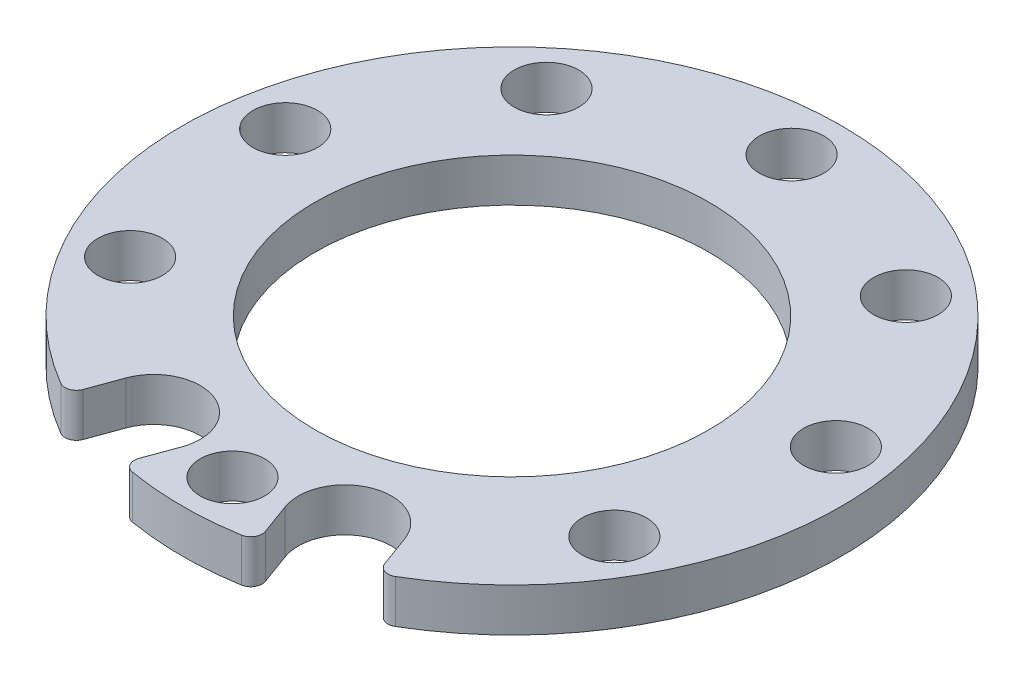
ISO-10303-21;
HEADER;
FILE_DESCRIPTION(('STEP AP214'),'2;1');
FILE_NAME('part.step','',(''),(''),'','','');
FILE_SCHEMA(('AUTOMOTIVE_DESIGN { 1 0 10303 214 1 1 1 1 }'));
ENDSEC;
DATA;
#1=APPLICATION_CONTEXT('core data for automotive mechanical design processes');
#2=APPLICATION_PROTOCOL_DEFINITION('international standard','automotive_design',2000,#1);
#3=PRODUCT_CONTEXT('',#1,'mechanical');
#4=PRODUCT('Part','Part','',(#3));
#5=PRODUCT_RELATED_PRODUCT_CATEGORY('part','',(#4));
#6=PRODUCT_DEFINITION_FORMATION('','',#4);
#7=PRODUCT_DEFINITION_CONTEXT('part definition',#1,'design');
#8=PRODUCT_DEFINITION('design','',#6,#7);
#9=PRODUCT_DEFINITION_SHAPE('','',#8);
#10=(LENGTH_UNIT() NAMED_UNIT(*) SI_UNIT(.MILLI.,.METRE.));
#11=(NAMED_UNIT(*) PLANE_ANGLE_UNIT() SI_UNIT($,.RADIAN.));
#12=(NAMED_UNIT(*) SI_UNIT($,.STERADIAN.) SOLID_ANGLE_UNIT());
#13=UNCERTAINTY_MEASURE_WITH_UNIT(LENGTH_MEASURE(1.E-05),#10,'distance_accuracy_value','');
#14=(GEOMETRIC_REPRESENTATION_CONTEXT(3) GLOBAL_UNCERTAINTY_ASSIGNED_CONTEXT((#13)) GLOBAL_UNIT_ASSIGNED_CONTEXT((#10,
#11,#12)) REPRESENTATION_CONTEXT('',''));
#15=CARTESIAN_POINT('',(0.,0.,0.));
#16=DIRECTION('',(0.,0.,1.));
#17=DIRECTION('',(1.,0.,0.));
#18=AXIS2_PLACEMENT_3D('',#15,#16,#17);
#19=CARTESIAN_POINT('',(0.,6.04774,0.));
#20=DIRECTION('',(0.,-1.,0.));
#21=DIRECTION('',(0.,0.,-1.));
#22=AXIS2_PLACEMENT_3D('',#19,#20,#21);
#23=CYLINDRICAL_SURFACE('',#22,45.974);
#24=CARTESIAN_POINT('',(0.,6.04774,0.));
#25=DIRECTION('',(0.,1.,0.));
#26=DIRECTION('',(0.,0.,1.));
#27=AXIS2_PLACEMENT_3D('',#24,#25,#26);
#28=CIRCLE('',#27,45.974);
#29=CARTESIAN_POINT('',(23.3323913389135,6.04774,39.6132325165189));
#30=VERTEX_POINT('',#29);
#31=CARTESIAN_POINT('',(-23.3323913389135,6.04774,39.6132325165189));
#32=VERTEX_POINT('',#31);
#33=EDGE_CURVE('E187',#30,#32,#28,.T.);
#34=ORIENTED_EDGE('',*,*,#33,.F.);
#35=DIRECTION('',(0.,-1.,0.));
#36=VECTOR('',#35,1.);
#37=CARTESIAN_POINT('',(23.3323913389135,6.04774,39.6132325165189));
#38=LINE('',#37,#36);
#39=CARTESIAN_POINT('',(23.3323913389135,0.,39.6132325165189));
#40=VERTEX_POINT('',#39);
#41=EDGE_CURVE('E11',#30,#40,#38,.T.);
#42=ORIENTED_EDGE('',*,*,#41,.T.);
#43=CARTESIAN_POINT('',(0.,0.,0.));
#44=DIRECTION('',(0.,1.,0.));
#45=DIRECTION('',(0.,0.,1.));
#46=AXIS2_PLACEMENT_3D('',#43,#44,#45);
#47=CIRCLE('',#46,45.974);
#48=CARTESIAN_POINT('',(-23.3323913389135,0.,39.6132325165189));
#49=VERTEX_POINT('',#48);
#50=EDGE_CURVE('E178',#40,#49,#47,.T.);
#51=ORIENTED_EDGE('',*,*,#50,.T.);
#52=DIRECTION('',(0.,-1.,0.));
#53=VECTOR('',#52,1.);
#54=CARTESIAN_POINT('',(-23.3323913389135,6.04774,39.6132325165189));
#55=LINE('',#54,#53);
#56=EDGE_CURVE('E201',#49,#32,#55,.F.);
#57=ORIENTED_EDGE('',*,*,#56,.T.);
#58=EDGE_LOOP('',(#34,#42,#51,#57));
#59=FACE_BOUND('',#58,.T.);
#60=ADVANCED_FACE('F41',(#59),#23,.T.);
#61=CARTESIAN_POINT('',(13.3387855897043,6.04774,36.6480122106499));
#62=DIRECTION('',(0.,-1.,0.));
#63=DIRECTION('',(0.,0.,-1.));
#64=AXIS2_PLACEMENT_3D('',#61,#62,#63);
#65=CYLINDRICAL_SURFACE('',#64,6.5);
#66=CARTESIAN_POINT('',(13.3387855897043,6.04774,36.6480122106499));
#67=DIRECTION('',(0.,1.,0.));
#68=DIRECTION('',(0.,0.,1.));
#69=AXIS2_PLACEMENT_3D('',#66,#67,#68);
#70=CIRCLE('',#69,6.5);
#71=CARTESIAN_POINT('',(19.4467876248127,6.04774,34.424881279033));
#72=VERTEX_POINT('',#71);
#73=CARTESIAN_POINT('',(7.23078355458947,6.04774,38.8711431422678));
#74=VERTEX_POINT('',#73);
#75=EDGE_CURVE('E155',#72,#74,#70,.T.);
#76=ORIENTED_EDGE('',*,*,#75,.T.);
#77=DIRECTION('',(0.,1.,0.));
#78=VECTOR('',#77,1.);
#79=CARTESIAN_POINT('',(7.23078355458947,0.,38.8711431422678));
#80=LINE('',#79,#78);
#81=CARTESIAN_POINT('',(7.2307835545959,0.,38.8711431422667));
#82=VERTEX_POINT('',#81);
#83=EDGE_CURVE('E142',#82,#74,#80,.T.);
#84=ORIENTED_EDGE('',*,*,#83,.F.);
#85=CARTESIAN_POINT('',(13.3387855897043,0.,36.6480122106499));
#86=DIRECTION('',(0.,1.,0.));
#87=DIRECTION('',(0.,0.,1.));
#88=AXIS2_PLACEMENT_3D('',#85,#86,#87);
#89=CIRCLE('',#88,6.5);
#90=CARTESIAN_POINT('',(19.4467876248063,0.,34.4248812790341));
#91=VERTEX_POINT('',#90);
#92=EDGE_CURVE('E148',#91,#82,#89,.T.);
#93=ORIENTED_EDGE('',*,*,#92,.F.);
#94=DIRECTION('',(0.,1.,0.));
#95=VECTOR('',#94,1.);
#96=CARTESIAN_POINT('',(19.4467876248063,0.,34.4248812790341));
#97=LINE('',#96,#95);
#98=EDGE_CURVE('E130',#91,#72,#97,.T.);
#99=ORIENTED_EDGE('',*,*,#98,.T.);
#100=EDGE_LOOP('',(#76,#84,#93,#99));
#101=FACE_BOUND('',#100,.T.);
#102=ADVANCED_FACE('F153',(#101),#65,.F.);
#103=CARTESIAN_POINT('',(0.,6.04774,0.));
#104=DIRECTION('',(0.,1.,0.));
#105=DIRECTION('',(0.,0.,1.));
#106=AXIS2_PLACEMENT_3D('',#103,#104,#105);
#107=PLANE('',#106);
#108=CARTESIAN_POINT('',(-7.58924631139159,6.04774,45.3432687002716));
#109=VERTEX_POINT('',#108);
#110=CARTESIAN_POINT('',(7.58924631139159,6.04774,45.3432687002716));
#111=VERTEX_POINT('',#110);
#112=EDGE_CURVE('E182',#109,#111,#28,.T.);
#113=ORIENTED_EDGE('',*,*,#112,.T.);
#114=CARTESIAN_POINT('',(7.3271867011916,6.04774,43.7775480959804));
#115=DIRECTION('',(0.,1.,0.));
#116=DIRECTION('',(0.,0.,1.));
#117=AXIS2_PLACEMENT_3D('',#114,#115,#116);
#118=CIRCLE('',#117,1.5875);
#119=CARTESIAN_POINT('',(8.81894873668922,6.04774,43.2345911184509));
#120=VERTEX_POINT('',#119);
#121=EDGE_CURVE('E225',#111,#120,#118,.T.);
#122=ORIENTED_EDGE('',*,*,#121,.T.);
#123=DIRECTION('',(0.34202014332567,0.,0.939692620785908));
#124=VECTOR('',#123,1.);
#125=CARTESIAN_POINT('',(-6.10800203511149,6.04774,2.22313093161798));
#126=LINE('',#125,#124);
#127=EDGE_CURVE('E242',#74,#120,#126,.T.);
#128=ORIENTED_EDGE('',*,*,#127,.F.);
#129=ORIENTED_EDGE('',*,*,#75,.F.);
#130=DIRECTION('',(0.342020143325668,0.,0.939692620785909));
#131=VECTOR('',#130,1.);
#132=CARTESIAN_POINT('',(6.1080020351054,6.04774,-2.22313093161575));
#133=LINE('',#132,#131);
#134=CARTESIAN_POINT('',(21.0349528069064,6.04774,38.7883292552184));
#135=VERTEX_POINT('',#134);
#136=EDGE_CURVE('E136',#72,#135,#133,.T.);
#137=ORIENTED_EDGE('',*,*,#136,.T.);
#138=CARTESIAN_POINT('',(22.5267148424041,6.04774,38.2453722776889));
#139=DIRECTION('',(0.,1.,0.));
#140=DIRECTION('',(0.,0.,1.));
#141=AXIS2_PLACEMENT_3D('',#138,#139,#140);
#142=CIRCLE('',#141,1.5875);
#143=EDGE_CURVE('E222',#135,#30,#142,.T.);
#144=ORIENTED_EDGE('',*,*,#143,.T.);
#145=ORIENTED_EDGE('',*,*,#33,.T.);
#146=CARTESIAN_POINT('',(-22.5267148424041,6.04774,38.2453722776889));
#147=DIRECTION('',(0.,1.,0.));
#148=DIRECTION('',(0.,0.,1.));
#149=AXIS2_PLACEMENT_3D('',#146,#147,#148);
#150=CIRCLE('',#149,1.5875);
#151=CARTESIAN_POINT('',(-21.0349528069064,6.04774,38.7883292552184));
#152=VERTEX_POINT('',#151);
#153=EDGE_CURVE('E195',#32,#152,#150,.T.);
#154=ORIENTED_EDGE('',*,*,#153,.T.);
#155=DIRECTION('',(-0.342020143325668,0.,0.939692620785909));
#156=VECTOR('',#155,1.);
#157=CARTESIAN_POINT('',(-6.1080020351054,6.04774,-2.22313093161575));
#158=LINE('',#157,#156);
#159=CARTESIAN_POINT('',(-19.4467876248063,6.04774,34.4248812790341));
#160=VERTEX_POINT('',#159);
#161=EDGE_CURVE('E258',#160,#152,#158,.T.);
#162=ORIENTED_EDGE('',*,*,#161,.F.);
#163=CARTESIAN_POINT('',(-13.3387855896979,6.04774,36.648012210651));
#164=DIRECTION('',(0.,1.,0.));
#165=DIRECTION('',(0.,0.,1.));
#166=AXIS2_PLACEMENT_3D('',#163,#164,#165);
#167=CIRCLE('',#166,6.5);
#168=CARTESIAN_POINT('',(-7.23078355458947,6.04774,38.8711431422678));
#169=VERTEX_POINT('',#168);
#170=EDGE_CURVE('E166',#169,#160,#167,.T.);
#171=ORIENTED_EDGE('',*,*,#170,.F.);
#172=DIRECTION('',(-0.34202014332567,0.,0.939692620785908));
#173=VECTOR('',#172,1.);
#174=CARTESIAN_POINT('',(6.10800203511149,6.04774,2.22313093161798));
#175=LINE('',#174,#173);
#176=CARTESIAN_POINT('',(-8.81894873668922,6.04774,43.2345911184509));
#177=VERTEX_POINT('',#176);
#178=EDGE_CURVE('E251',#169,#177,#175,.T.);
#179=ORIENTED_EDGE('',*,*,#178,.T.);
#180=CARTESIAN_POINT('',(-7.3271867011916,6.04774,43.7775480959804));
#181=DIRECTION('',(0.,1.,0.));
#182=DIRECTION('',(0.,0.,1.));
#183=AXIS2_PLACEMENT_3D('',#180,#181,#182);
#184=CIRCLE('',#183,1.5875);
#185=EDGE_CURVE('E198',#177,#109,#184,.T.);
#186=ORIENTED_EDGE('',*,*,#185,.T.);
#187=EDGE_LOOP('',(#113,#122,#128,#129,#137,#144,#145,#154,#162,#171,#179,#186));
#188=FACE_BOUND('',#187,.T.);
#189=CARTESIAN_POINT('',(-25.0687167777747,6.04774,-29.8757332816405));
#190=DIRECTION('',(0.,1.,0.));
#191=DIRECTION('',(0.,0.,1.));
#192=AXIS2_PLACEMENT_3D('',#189,#190,#191);
#193=CIRCLE('',#192,4.49999999999999);
#194=CARTESIAN_POINT('',(-25.0687167777747,6.04774,-25.3757332816405));
#195=VERTEX_POINT('',#194);
#196=EDGE_CURVE('E272',#195,#195,#193,.T.);
#197=ORIENTED_EDGE('',*,*,#196,.F.);
#198=EDGE_LOOP('',(#197));
#199=FACE_BOUND('',#198,.T.);
#200=CARTESIAN_POINT('',(-38.407502367476,6.04774,-6.77227892901068));
#201=DIRECTION('',(0.,1.,0.));
#202=DIRECTION('',(0.,0.,1.));
#203=AXIS2_PLACEMENT_3D('',#200,#201,#202);
#204=CIRCLE('',#203,4.49999999999999);
#205=CARTESIAN_POINT('',(-38.407502367476,6.04774,-2.27227892901069));
#206=VERTEX_POINT('',#205);
#207=EDGE_CURVE('E283',#206,#206,#204,.T.);
#208=ORIENTED_EDGE('',*,*,#207,.F.);
#209=EDGE_LOOP('',(#208));
#210=FACE_BOUND('',#209,.T.);
#211=CARTESIAN_POINT('',(-33.7749907475933,6.04774,19.4999999999997));
#212=DIRECTION('',(0.,1.,0.));
#213=DIRECTION('',(0.,0.,1.));
#214=AXIS2_PLACEMENT_3D('',#211,#212,#213);
#215=CIRCLE('',#214,4.49999999999999);
#216=CARTESIAN_POINT('',(-33.7749907475933,6.04774,23.9999999999997));
#217=VERTEX_POINT('',#216);
#218=EDGE_CURVE('E291',#217,#217,#215,.T.);
#219=ORIENTED_EDGE('',*,*,#218,.F.);
#220=EDGE_LOOP('',(#219));
#221=FACE_BOUND('',#220,.T.);
#222=CARTESIAN_POINT('',(0.,6.04774,39.));
#223=DIRECTION('',(0.,1.,0.));
#224=DIRECTION('',(0.,0.,1.));
#225=AXIS2_PLACEMENT_3D('',#222,#223,#224);
#226=CIRCLE('',#225,4.49999999999999);
#227=CARTESIAN_POINT('',(0.,6.04774,43.5));
#228=VERTEX_POINT('',#227);
#229=EDGE_CURVE('E299',#228,#228,#226,.T.);
#230=ORIENTED_EDGE('',*,*,#229,.F.);
#231=EDGE_LOOP('',(#230));
#232=FACE_BOUND('',#231,.T.);
#233=CARTESIAN_POINT('',(33.774990747593,6.04774,19.5000000000002));
#234=DIRECTION('',(0.,1.,0.));
#235=DIRECTION('',(0.,0.,1.));
#236=AXIS2_PLACEMENT_3D('',#233,#234,#235);
#237=CIRCLE('',#236,4.49999999999999);
#238=CARTESIAN_POINT('',(33.774990747593,6.04774,24.0000000000001));
#239=VERTEX_POINT('',#238);
#240=EDGE_CURVE('E307',#239,#239,#237,.T.);
#241=ORIENTED_EDGE('',*,*,#240,.F.);
#242=EDGE_LOOP('',(#241));
#243=FACE_BOUND('',#242,.T.);
#244=CARTESIAN_POINT('',(38.4075023674761,6.04774,-6.77227892901017));
#245=DIRECTION('',(0.,1.,0.));
#246=DIRECTION('',(0.,0.,1.));
#247=AXIS2_PLACEMENT_3D('',#244,#245,#246);
#248=CIRCLE('',#247,4.49999999999999);
#249=CARTESIAN_POINT('',(38.4075023674761,6.04774,-2.27227892901018));
#250=VERTEX_POINT('',#249);
#251=EDGE_CURVE('E315',#250,#250,#248,.T.);
#252=ORIENTED_EDGE('',*,*,#251,.F.);
#253=EDGE_LOOP('',(#252));
#254=FACE_BOUND('',#253,.T.);
#255=CARTESIAN_POINT('',(25.0687167777751,6.04774,-29.8757332816401));
#256=DIRECTION('',(0.,1.,0.));
#257=DIRECTION('',(0.,0.,1.));
#258=AXIS2_PLACEMENT_3D('',#255,#256,#257);
#259=CIRCLE('',#258,4.49999999999999);
#260=CARTESIAN_POINT('',(25.0687167777751,6.04774,-25.3757332816401));
#261=VERTEX_POINT('',#260);
#262=EDGE_CURVE('E323',#261,#261,#259,.T.);
#263=ORIENTED_EDGE('',*,*,#262,.F.);
#264=EDGE_LOOP('',(#263));
#265=FACE_BOUND('',#264,.T.);
#266=CARTESIAN_POINT('',(0.,6.04774,-39.));
#267=DIRECTION('',(0.,1.,0.));
#268=DIRECTION('',(0.,0.,1.));
#269=AXIS2_PLACEMENT_3D('',#266,#267,#268);
#270=CIRCLE('',#269,4.49999999999999);
#271=CARTESIAN_POINT('',(0.,6.04774,-34.5));
#272=VERTEX_POINT('',#271);
#273=EDGE_CURVE('E163',#272,#272,#270,.T.);
#274=ORIENTED_EDGE('',*,*,#273,.F.);
#275=EDGE_LOOP('',(#274));
#276=FACE_BOUND('',#275,.T.);
#277=CARTESIAN_POINT('',(0.,6.04774,0.));
#278=DIRECTION('',(0.,1.,0.));
#279=DIRECTION('',(0.,0.,1.));
#280=AXIS2_PLACEMENT_3D('',#277,#278,#279);
#281=CIRCLE('',#280,27.4955);
#282=CARTESIAN_POINT('',(0.,6.04774,27.4955));
#283=VERTEX_POINT('',#282);
#284=EDGE_CURVE('E174',#283,#283,#281,.T.);
#285=ORIENTED_EDGE('',*,*,#284,.F.);
#286=EDGE_LOOP('',(#285));
#287=FACE_BOUND('',#286,.T.);
#288=ADVANCED_FACE('F238',(#188,#199,#210,#221,#232,#243,#254,#265,#276,#287),#107,.T.);
#289=CARTESIAN_POINT('',(0.,0.,0.));
#290=DIRECTION('',(0.,1.,0.));
#291=DIRECTION('',(0.,0.,1.));
#292=AXIS2_PLACEMENT_3D('',#289,#290,#291);
#293=PLANE('',#292);
#294=DIRECTION('',(0.34202014332567,0.,0.939692620785908));
#295=VECTOR('',#294,1.);
#296=CARTESIAN_POINT('',(-6.10800203511149,0.,2.22313093161798));
#297=LINE('',#296,#295);
#298=CARTESIAN_POINT('',(8.81894873668922,0.,43.2345911184509));
#299=VERTEX_POINT('',#298);
#300=EDGE_CURVE('E150',#82,#299,#297,.T.);
#301=ORIENTED_EDGE('',*,*,#300,.T.);
#302=CARTESIAN_POINT('',(7.3271867011916,0.,43.7775480959804));
#303=DIRECTION('',(0.,1.,0.));
#304=DIRECTION('',(0.,0.,1.));
#305=AXIS2_PLACEMENT_3D('',#302,#303,#304);
#306=CIRCLE('',#305,1.5875);
#307=CARTESIAN_POINT('',(7.58924631139159,0.,45.3432687002716));
#308=VERTEX_POINT('',#307);
#309=EDGE_CURVE('E233',#299,#308,#306,.F.);
#310=ORIENTED_EDGE('',*,*,#309,.T.);
#311=CARTESIAN_POINT('',(-7.58924631139159,0.,45.3432687002716));
#312=VERTEX_POINT('',#311);
#313=EDGE_CURVE('E188',#312,#308,#47,.T.);
#314=ORIENTED_EDGE('',*,*,#313,.F.);
#315=CARTESIAN_POINT('',(-7.3271867011916,0.,43.7775480959804));
#316=DIRECTION('',(0.,1.,0.));
#317=DIRECTION('',(0.,0.,1.));
#318=AXIS2_PLACEMENT_3D('',#315,#316,#317);
#319=CIRCLE('',#318,1.5875);
#320=CARTESIAN_POINT('',(-8.81894873668922,0.,43.2345911184509));
#321=VERTEX_POINT('',#320);
#322=EDGE_CURVE('E212',#312,#321,#319,.F.);
#323=ORIENTED_EDGE('',*,*,#322,.T.);
#324=DIRECTION('',(-0.34202014332567,0.,0.939692620785908));
#325=VECTOR('',#324,1.);
#326=CARTESIAN_POINT('',(6.10800203511149,0.,2.22313093161798));
#327=LINE('',#326,#325);
#328=CARTESIAN_POINT('',(-7.23078355458947,0.,38.8711431422678));
#329=VERTEX_POINT('',#328);
#330=EDGE_CURVE('E253',#329,#321,#327,.T.);
#331=ORIENTED_EDGE('',*,*,#330,.F.);
#332=CARTESIAN_POINT('',(-13.3387855896979,0.,36.648012210651));
#333=DIRECTION('',(0.,1.,0.));
#334=DIRECTION('',(0.,0.,1.));
#335=AXIS2_PLACEMENT_3D('',#332,#333,#334);
#336=CIRCLE('',#335,6.5);
#337=CARTESIAN_POINT('',(-19.4467876248063,0.,34.4248812790341));
#338=VERTEX_POINT('',#337);
#339=EDGE_CURVE('E160',#329,#338,#336,.T.);
#340=ORIENTED_EDGE('',*,*,#339,.T.);
#341=DIRECTION('',(-0.342020143325668,0.,0.939692620785909));
#342=VECTOR('',#341,1.);
#343=CARTESIAN_POINT('',(-6.1080020351054,0.,-2.22313093161575));
#344=LINE('',#343,#342);
#345=CARTESIAN_POINT('',(-21.0349528069064,0.,38.7883292552184));
#346=VERTEX_POINT('',#345);
#347=EDGE_CURVE('E257',#338,#346,#344,.T.);
#348=ORIENTED_EDGE('',*,*,#347,.T.);
#349=CARTESIAN_POINT('',(-22.5267148424041,0.,38.2453722776889));
#350=DIRECTION('',(0.,1.,0.));
#351=DIRECTION('',(0.,0.,1.));
#352=AXIS2_PLACEMENT_3D('',#349,#350,#351);
#353=CIRCLE('',#352,1.5875);
#354=EDGE_CURVE('E208',#346,#49,#353,.F.);
#355=ORIENTED_EDGE('',*,*,#354,.T.);
#356=ORIENTED_EDGE('',*,*,#50,.F.);
#357=CARTESIAN_POINT('',(22.5267148424041,0.,38.2453722776889));
#358=DIRECTION('',(0.,1.,0.));
#359=DIRECTION('',(0.,0.,1.));
#360=AXIS2_PLACEMENT_3D('',#357,#358,#359);
#361=CIRCLE('',#360,1.5875);
#362=CARTESIAN_POINT('',(21.0349528069064,0.,38.7883292552184));
#363=VERTEX_POINT('',#362);
#364=EDGE_CURVE('E57',#40,#363,#361,.F.);
#365=ORIENTED_EDGE('',*,*,#364,.T.);
#366=DIRECTION('',(0.342020143325668,0.,0.939692620785909));
#367=VECTOR('',#366,1.);
#368=CARTESIAN_POINT('',(6.1080020351054,0.,-2.22313093161575));
#369=LINE('',#368,#367);
#370=EDGE_CURVE('E133',#91,#363,#369,.T.);
#371=ORIENTED_EDGE('',*,*,#370,.F.);
#372=ORIENTED_EDGE('',*,*,#92,.T.);
#373=EDGE_LOOP('',(#301,#310,#314,#323,#331,#340,#348,#355,#356,#365,#371,#372));
#374=FACE_BOUND('',#373,.T.);
#375=CARTESIAN_POINT('',(0.,0.,0.));
#376=DIRECTION('',(0.,1.,0.));
#377=DIRECTION('',(0.,0.,1.));
#378=AXIS2_PLACEMENT_3D('',#375,#376,#377);
#379=CIRCLE('',#378,27.4955);
#380=CARTESIAN_POINT('',(0.,0.,27.4955));
#381=VERTEX_POINT('',#380);
#382=EDGE_CURVE('E170',#381,#381,#379,.T.);
#383=ORIENTED_EDGE('',*,*,#382,.T.);
#384=EDGE_LOOP('',(#383));
#385=FACE_BOUND('',#384,.T.);
#386=CARTESIAN_POINT('',(0.,0.,-39.));
#387=DIRECTION('',(0.,1.,0.));
#388=DIRECTION('',(0.,0.,1.));
#389=AXIS2_PLACEMENT_3D('',#386,#387,#388);
#390=CIRCLE('',#389,4.5);
#391=CARTESIAN_POINT('',(0.,0.,-34.5));
#392=VERTEX_POINT('',#391);
#393=EDGE_CURVE('E156',#392,#392,#390,.T.);
#394=ORIENTED_EDGE('',*,*,#393,.T.);
#395=EDGE_LOOP('',(#394));
#396=FACE_BOUND('',#395,.T.);
#397=CARTESIAN_POINT('',(25.0687167777751,0.,-29.8757332816401));
#398=DIRECTION('',(0.,1.,0.));
#399=DIRECTION('',(0.,0.,1.));
#400=AXIS2_PLACEMENT_3D('',#397,#398,#399);
#401=CIRCLE('',#400,4.5);
#402=CARTESIAN_POINT('',(25.0687167777751,0.,-25.3757332816401));
#403=VERTEX_POINT('',#402);
#404=EDGE_CURVE('E327',#403,#403,#401,.T.);
#405=ORIENTED_EDGE('',*,*,#404,.T.);
#406=EDGE_LOOP('',(#405));
#407=FACE_BOUND('',#406,.T.);
#408=CARTESIAN_POINT('',(38.4075023674761,0.,-6.77227892901017));
#409=DIRECTION('',(0.,1.,0.));
#410=DIRECTION('',(0.,0.,1.));
#411=AXIS2_PLACEMENT_3D('',#408,#409,#410);
#412=CIRCLE('',#411,4.5);
#413=CARTESIAN_POINT('',(38.4075023674761,0.,-2.27227892901017));
#414=VERTEX_POINT('',#413);
#415=EDGE_CURVE('E319',#414,#414,#412,.T.);
#416=ORIENTED_EDGE('',*,*,#415,.T.);
#417=EDGE_LOOP('',(#416));
#418=FACE_BOUND('',#417,.T.);
#419=CARTESIAN_POINT('',(33.774990747593,0.,19.5000000000002));
#420=DIRECTION('',(0.,1.,0.));
#421=DIRECTION('',(0.,0.,1.));
#422=AXIS2_PLACEMENT_3D('',#419,#420,#421);
#423=CIRCLE('',#422,4.5);
#424=CARTESIAN_POINT('',(33.774990747593,0.,24.0000000000002));
#425=VERTEX_POINT('',#424);
#426=EDGE_CURVE('E311',#425,#425,#423,.T.);
#427=ORIENTED_EDGE('',*,*,#426,.T.);
#428=EDGE_LOOP('',(#427));
#429=FACE_BOUND('',#428,.T.);
#430=CARTESIAN_POINT('',(0.,0.,39.));
#431=DIRECTION('',(0.,1.,0.));
#432=DIRECTION('',(0.,0.,1.));
#433=AXIS2_PLACEMENT_3D('',#430,#431,#432);
#434=CIRCLE('',#433,4.5);
#435=CARTESIAN_POINT('',(0.,0.,43.5));
#436=VERTEX_POINT('',#435);
#437=EDGE_CURVE('E303',#436,#436,#434,.T.);
#438=ORIENTED_EDGE('',*,*,#437,.T.);
#439=EDGE_LOOP('',(#438));
#440=FACE_BOUND('',#439,.T.);
#441=CARTESIAN_POINT('',(-33.7749907475933,0.,19.4999999999997));
#442=DIRECTION('',(0.,1.,0.));
#443=DIRECTION('',(0.,0.,1.));
#444=AXIS2_PLACEMENT_3D('',#441,#442,#443);
#445=CIRCLE('',#444,4.5);
#446=CARTESIAN_POINT('',(-33.7749907475933,0.,23.9999999999997));
#447=VERTEX_POINT('',#446);
#448=EDGE_CURVE('E295',#447,#447,#445,.T.);
#449=ORIENTED_EDGE('',*,*,#448,.T.);
#450=EDGE_LOOP('',(#449));
#451=FACE_BOUND('',#450,.T.);
#452=CARTESIAN_POINT('',(-38.407502367476,0.,-6.77227892901068));
#453=DIRECTION('',(0.,1.,0.));
#454=DIRECTION('',(0.,0.,1.));
#455=AXIS2_PLACEMENT_3D('',#452,#453,#454);
#456=CIRCLE('',#455,4.5);
#457=CARTESIAN_POINT('',(-38.407502367476,0.,-2.27227892901067));
#458=VERTEX_POINT('',#457);
#459=EDGE_CURVE('E287',#458,#458,#456,.T.);
#460=ORIENTED_EDGE('',*,*,#459,.T.);
#461=EDGE_LOOP('',(#460));
#462=FACE_BOUND('',#461,.T.);
#463=CARTESIAN_POINT('',(-25.0687167777747,0.,-29.8757332816405));
#464=DIRECTION('',(0.,1.,0.));
#465=DIRECTION('',(0.,0.,1.));
#466=AXIS2_PLACEMENT_3D('',#463,#464,#465);
#467=CIRCLE('',#466,4.5);
#468=CARTESIAN_POINT('',(-25.0687167777747,0.,-25.3757332816405));
#469=VERTEX_POINT('',#468);
#470=EDGE_CURVE('E279',#469,#469,#467,.T.);
#471=ORIENTED_EDGE('',*,*,#470,.T.);
#472=EDGE_LOOP('',(#471));
#473=FACE_BOUND('',#472,.T.);
#474=ADVANCED_FACE('F146',(#374,#385,#396,#407,#418,#429,#440,#451,#462,#473),#293,.F.);
#475=ORIENTED_EDGE('',*,*,#313,.T.);
#476=DIRECTION('',(0.,-1.,0.));
#477=VECTOR('',#476,1.);
#478=CARTESIAN_POINT('',(7.58924631139159,6.04774,45.3432687002716));
#479=LINE('',#478,#477);
#480=EDGE_CURVE('E218',#308,#111,#479,.F.);
#481=ORIENTED_EDGE('',*,*,#480,.T.);
#482=ORIENTED_EDGE('',*,*,#112,.F.);
#483=DIRECTION('',(0.,-1.,0.));
#484=VECTOR('',#483,1.);
#485=CARTESIAN_POINT('',(-7.58924631139159,6.04774,45.3432687002716));
#486=LINE('',#485,#484);
#487=EDGE_CURVE('E205',#109,#312,#486,.T.);
#488=ORIENTED_EDGE('',*,*,#487,.T.);
#489=EDGE_LOOP('',(#475,#481,#482,#488));
#490=FACE_BOUND('',#489,.T.);
#491=ADVANCED_FACE('F346',(#490),#23,.T.);
#492=CARTESIAN_POINT('',(0.,6.04774,0.));
#493=DIRECTION('',(0.,-1.,0.));
#494=DIRECTION('',(0.,0.,-1.));
#495=AXIS2_PLACEMENT_3D('',#492,#493,#494);
#496=CYLINDRICAL_SURFACE('',#495,27.4955);
#497=ORIENTED_EDGE('',*,*,#284,.T.);
#498=EDGE_LOOP('',(#497));
#499=FACE_BOUND('',#498,.T.);
#500=ORIENTED_EDGE('',*,*,#382,.F.);
#501=EDGE_LOOP('',(#500));
#502=FACE_BOUND('',#501,.T.);
#503=ADVANCED_FACE('F342',(#499,#502),#496,.F.);
#504=CARTESIAN_POINT('',(-13.3387855896979,6.04774,36.648012210651));
#505=DIRECTION('',(0.,-1.,0.));
#506=DIRECTION('',(0.,0.,-1.));
#507=AXIS2_PLACEMENT_3D('',#504,#505,#506);
#508=CYLINDRICAL_SURFACE('',#507,6.5);
#509=DIRECTION('',(0.,1.,0.));
#510=VECTOR('',#509,1.);
#511=CARTESIAN_POINT('',(-7.23078355458947,0.,38.8711431422678));
#512=LINE('',#511,#510);
#513=EDGE_CURVE('E262',#329,#169,#512,.T.);
#514=ORIENTED_EDGE('',*,*,#513,.T.);
#515=ORIENTED_EDGE('',*,*,#170,.T.);
#516=DIRECTION('',(0.,1.,0.));
#517=VECTOR('',#516,1.);
#518=CARTESIAN_POINT('',(-19.4467876248063,0.,34.4248812790341));
#519=LINE('',#518,#517);
#520=EDGE_CURVE('E269',#338,#160,#519,.T.);
#521=ORIENTED_EDGE('',*,*,#520,.F.);
#522=ORIENTED_EDGE('',*,*,#339,.F.);
#523=EDGE_LOOP('',(#514,#515,#521,#522));
#524=FACE_BOUND('',#523,.T.);
#525=ADVANCED_FACE('F345',(#524),#508,.F.);
#526=CARTESIAN_POINT('',(0.,6.04774,-39.));
#527=DIRECTION('',(0.,1.,0.));
#528=DIRECTION('',(0.,0.,1.));
#529=AXIS2_PLACEMENT_3D('',#526,#527,#528);
#530=CYLINDRICAL_SURFACE('',#529,4.49999999999999);
#531=ORIENTED_EDGE('',*,*,#393,.F.);
#532=EDGE_LOOP('',(#531));
#533=FACE_BOUND('',#532,.T.);
#534=ORIENTED_EDGE('',*,*,#273,.T.);
#535=EDGE_LOOP('',(#534));
#536=FACE_BOUND('',#535,.T.);
#537=ADVANCED_FACE('F335',(#533,#536),#530,.F.);
#538=CARTESIAN_POINT('',(25.0687167777751,6.04774,-29.8757332816401));
#539=DIRECTION('',(0.,1.,0.));
#540=DIRECTION('',(0.,0.,1.));
#541=AXIS2_PLACEMENT_3D('',#538,#539,#540);
#542=CYLINDRICAL_SURFACE('',#541,4.49999999999999);
#543=ORIENTED_EDGE('',*,*,#404,.F.);
#544=EDGE_LOOP('',(#543));
#545=FACE_BOUND('',#544,.T.);
#546=ORIENTED_EDGE('',*,*,#262,.T.);
#547=EDGE_LOOP('',(#546));
#548=FACE_BOUND('',#547,.T.);
#549=ADVANCED_FACE('F388',(#545,#548),#542,.F.);
#550=CARTESIAN_POINT('',(38.4075023674761,6.04774,-6.77227892901017));
#551=DIRECTION('',(0.,1.,0.));
#552=DIRECTION('',(0.,0.,1.));
#553=AXIS2_PLACEMENT_3D('',#550,#551,#552);
#554=CYLINDRICAL_SURFACE('',#553,4.49999999999999);
#555=ORIENTED_EDGE('',*,*,#415,.F.);
#556=EDGE_LOOP('',(#555));
#557=FACE_BOUND('',#556,.T.);
#558=ORIENTED_EDGE('',*,*,#251,.T.);
#559=EDGE_LOOP('',(#558));
#560=FACE_BOUND('',#559,.T.);
#561=ADVANCED_FACE('F390',(#557,#560),#554,.F.);
#562=CARTESIAN_POINT('',(33.774990747593,6.04774,19.5000000000002));
#563=DIRECTION('',(0.,1.,0.));
#564=DIRECTION('',(0.,0.,1.));
#565=AXIS2_PLACEMENT_3D('',#562,#563,#564);
#566=CYLINDRICAL_SURFACE('',#565,4.5);
#567=ORIENTED_EDGE('',*,*,#426,.F.);
#568=EDGE_LOOP('',(#567));
#569=FACE_BOUND('',#568,.T.);
#570=ORIENTED_EDGE('',*,*,#240,.T.);
#571=EDGE_LOOP('',(#570));
#572=FACE_BOUND('',#571,.T.);
#573=ADVANCED_FACE('F397',(#569,#572),#566,.F.);
#574=CARTESIAN_POINT('',(0.,6.04774,39.));
#575=DIRECTION('',(0.,1.,0.));
#576=DIRECTION('',(0.,0.,1.));
#577=AXIS2_PLACEMENT_3D('',#574,#575,#576);
#578=CYLINDRICAL_SURFACE('',#577,4.49999999999999);
#579=ORIENTED_EDGE('',*,*,#437,.F.);
#580=EDGE_LOOP('',(#579));
#581=FACE_BOUND('',#580,.T.);
#582=ORIENTED_EDGE('',*,*,#229,.T.);
#583=EDGE_LOOP('',(#582));
#584=FACE_BOUND('',#583,.T.);
#585=ADVANCED_FACE('F447',(#581,#584),#578,.F.);
#586=CARTESIAN_POINT('',(-33.7749907475933,6.04774,19.4999999999997));
#587=DIRECTION('',(0.,1.,0.));
#588=DIRECTION('',(0.,0.,1.));
#589=AXIS2_PLACEMENT_3D('',#586,#587,#588);
#590=CYLINDRICAL_SURFACE('',#589,4.5);
#591=ORIENTED_EDGE('',*,*,#448,.F.);
#592=EDGE_LOOP('',(#591));
#593=FACE_BOUND('',#592,.T.);
#594=ORIENTED_EDGE('',*,*,#218,.T.);
#595=EDGE_LOOP('',(#594));
#596=FACE_BOUND('',#595,.T.);
#597=ADVANCED_FACE('F443',(#593,#596),#590,.F.);
#598=CARTESIAN_POINT('',(-38.407502367476,6.04774,-6.77227892901068));
#599=DIRECTION('',(0.,1.,0.));
#600=DIRECTION('',(0.,0.,1.));
#601=AXIS2_PLACEMENT_3D('',#598,#599,#600);
#602=CYLINDRICAL_SURFACE('',#601,4.5);
#603=ORIENTED_EDGE('',*,*,#459,.F.);
#604=EDGE_LOOP('',(#603));
#605=FACE_BOUND('',#604,.T.);
#606=ORIENTED_EDGE('',*,*,#207,.T.);
#607=EDGE_LOOP('',(#606));
#608=FACE_BOUND('',#607,.T.);
#609=ADVANCED_FACE('F372',(#605,#608),#602,.F.);
#610=CARTESIAN_POINT('',(-25.0687167777747,6.04774,-29.8757332816405));
#611=DIRECTION('',(0.,1.,0.));
#612=DIRECTION('',(0.,0.,1.));
#613=AXIS2_PLACEMENT_3D('',#610,#611,#612);
#614=CYLINDRICAL_SURFACE('',#613,4.5);
#615=ORIENTED_EDGE('',*,*,#470,.F.);
#616=EDGE_LOOP('',(#615));
#617=FACE_BOUND('',#616,.T.);
#618=ORIENTED_EDGE('',*,*,#196,.T.);
#619=EDGE_LOOP('',(#618));
#620=FACE_BOUND('',#619,.T.);
#621=ADVANCED_FACE('F368',(#617,#620),#614,.F.);
#622=CARTESIAN_POINT('',(-6.1080020351054,0.,-2.22313093161575));
#623=DIRECTION('',(-0.939692620785908,0.,-0.342020143325668));
#624=DIRECTION('',(-0.342020143325668,0.,0.939692620785909));
#625=AXIS2_PLACEMENT_3D('',#622,#623,#624);
#626=PLANE('',#625);
#627=ORIENTED_EDGE('',*,*,#161,.T.);
#628=DIRECTION('',(0.,-1.,0.));
#629=VECTOR('',#628,1.);
#630=CARTESIAN_POINT('',(-21.0349528069064,0.,38.7883292552184));
#631=LINE('',#630,#629);
#632=EDGE_CURVE('E215',#152,#346,#631,.T.);
#633=ORIENTED_EDGE('',*,*,#632,.T.);
#634=ORIENTED_EDGE('',*,*,#347,.F.);
#635=ORIENTED_EDGE('',*,*,#520,.T.);
#636=EDGE_LOOP('',(#627,#633,#634,#635));
#637=FACE_BOUND('',#636,.T.);
#638=ADVANCED_FACE('F371',(#637),#626,.F.);
#639=CARTESIAN_POINT('',(6.10800203511149,0.,2.22313093161798));
#640=DIRECTION('',(-0.939692620785908,0.,-0.34202014332567));
#641=DIRECTION('',(-0.342020143325671,0.,0.939692620785908));
#642=AXIS2_PLACEMENT_3D('',#639,#640,#641);
#643=PLANE('',#642);
#644=ORIENTED_EDGE('',*,*,#330,.T.);
#645=DIRECTION('',(0.,1.,0.));
#646=VECTOR('',#645,1.);
#647=CARTESIAN_POINT('',(-8.81894873668922,6.04774,43.2345911184509));
#648=LINE('',#647,#646);
#649=EDGE_CURVE('E186',#321,#177,#648,.T.);
#650=ORIENTED_EDGE('',*,*,#649,.T.);
#651=ORIENTED_EDGE('',*,*,#178,.F.);
#652=ORIENTED_EDGE('',*,*,#513,.F.);
#653=EDGE_LOOP('',(#644,#650,#651,#652));
#654=FACE_BOUND('',#653,.T.);
#655=ADVANCED_FACE('F435',(#654),#643,.T.);
#656=CARTESIAN_POINT('',(-7.3271867011916,6.04774,43.7775480959804));
#657=DIRECTION('',(0.,-1.,0.));
#658=DIRECTION('',(0.,0.,-1.));
#659=AXIS2_PLACEMENT_3D('',#656,#657,#658);
#660=CYLINDRICAL_SURFACE('',#659,1.5875);
#661=ORIENTED_EDGE('',*,*,#322,.F.);
#662=ORIENTED_EDGE('',*,*,#487,.F.);
#663=ORIENTED_EDGE('',*,*,#185,.F.);
#664=ORIENTED_EDGE('',*,*,#649,.F.);
#665=EDGE_LOOP('',(#661,#662,#663,#664));
#666=FACE_BOUND('',#665,.T.);
#667=ADVANCED_FACE('F438',(#666),#660,.T.);
#668=CARTESIAN_POINT('',(-22.5267148424041,6.04774,38.2453722776889));
#669=DIRECTION('',(0.,-1.,0.));
#670=DIRECTION('',(0.,0.,-1.));
#671=AXIS2_PLACEMENT_3D('',#668,#669,#670);
#672=CYLINDRICAL_SURFACE('',#671,1.5875);
#673=ORIENTED_EDGE('',*,*,#354,.F.);
#674=ORIENTED_EDGE('',*,*,#632,.F.);
#675=ORIENTED_EDGE('',*,*,#153,.F.);
#676=ORIENTED_EDGE('',*,*,#56,.F.);
#677=EDGE_LOOP('',(#673,#674,#675,#676));
#678=FACE_BOUND('',#677,.T.);
#679=ADVANCED_FACE('F430',(#678),#672,.T.);
#680=CARTESIAN_POINT('',(6.1080020351054,0.,-2.22313093161575));
#681=DIRECTION('',(-0.939692620785908,0.,0.342020143325668));
#682=DIRECTION('',(0.342020143325668,0.,0.939692620785909));
#683=AXIS2_PLACEMENT_3D('',#680,#681,#682);
#684=PLANE('',#683);
#685=ORIENTED_EDGE('',*,*,#370,.T.);
#686=DIRECTION('',(0.,1.,0.));
#687=VECTOR('',#686,1.);
#688=CARTESIAN_POINT('',(21.0349528069064,6.04774,38.7883292552184));
#689=LINE('',#688,#687);
#690=EDGE_CURVE('E50',#363,#135,#689,.T.);
#691=ORIENTED_EDGE('',*,*,#690,.T.);
#692=ORIENTED_EDGE('',*,*,#136,.F.);
#693=ORIENTED_EDGE('',*,*,#98,.F.);
#694=EDGE_LOOP('',(#685,#691,#692,#693));
#695=FACE_BOUND('',#694,.T.);
#696=ADVANCED_FACE('F131',(#695),#684,.T.);
#697=CARTESIAN_POINT('',(-6.10800203511149,0.,2.22313093161798));
#698=DIRECTION('',(-0.939692620785908,0.,0.34202014332567));
#699=DIRECTION('',(0.342020143325671,0.,0.939692620785908));
#700=AXIS2_PLACEMENT_3D('',#697,#698,#699);
#701=PLANE('',#700);
#702=ORIENTED_EDGE('',*,*,#127,.T.);
#703=DIRECTION('',(0.,-1.,0.));
#704=VECTOR('',#703,1.);
#705=CARTESIAN_POINT('',(8.81894873668922,0.,43.2345911184509));
#706=LINE('',#705,#704);
#707=EDGE_CURVE('E228',#120,#299,#706,.T.);
#708=ORIENTED_EDGE('',*,*,#707,.T.);
#709=ORIENTED_EDGE('',*,*,#300,.F.);
#710=ORIENTED_EDGE('',*,*,#83,.T.);
#711=EDGE_LOOP('',(#702,#708,#709,#710));
#712=FACE_BOUND('',#711,.T.);
#713=ADVANCED_FACE('F423',(#712),#701,.F.);
#714=CARTESIAN_POINT('',(7.3271867011916,6.04774,43.7775480959804));
#715=DIRECTION('',(0.,-1.,0.));
#716=DIRECTION('',(0.,0.,-1.));
#717=AXIS2_PLACEMENT_3D('',#714,#715,#716);
#718=CYLINDRICAL_SURFACE('',#717,1.5875);
#719=ORIENTED_EDGE('',*,*,#309,.F.);
#720=ORIENTED_EDGE('',*,*,#707,.F.);
#721=ORIENTED_EDGE('',*,*,#121,.F.);
#722=ORIENTED_EDGE('',*,*,#480,.F.);
#723=EDGE_LOOP('',(#719,#720,#721,#722));
#724=FACE_BOUND('',#723,.T.);
#725=ADVANCED_FACE('F420',(#724),#718,.T.);
#726=CARTESIAN_POINT('',(22.5267148424041,6.04774,38.2453722776889));
#727=DIRECTION('',(0.,-1.,0.));
#728=DIRECTION('',(0.,0.,-1.));
#729=AXIS2_PLACEMENT_3D('',#726,#727,#728);
#730=CYLINDRICAL_SURFACE('',#729,1.5875);
#731=ORIENTED_EDGE('',*,*,#364,.F.);
#732=ORIENTED_EDGE('',*,*,#41,.F.);
#733=ORIENTED_EDGE('',*,*,#143,.F.);
#734=ORIENTED_EDGE('',*,*,#690,.F.);
#735=EDGE_LOOP('',(#731,#732,#733,#734));
#736=FACE_BOUND('',#735,.T.);
#737=ADVANCED_FACE('F43',(#736),#730,.T.);
#738=CLOSED_SHELL('',(#60,#102,#288,#474,#491,#503,#525,#537,#549,#561,#573,#585,#597,#609,#621,
#638,#655,#667,#679,#696,#713,#725,#737));
#739=MANIFOLD_SOLID_BREP('B2',#738);
#740=ADVANCED_BREP_SHAPE_REPRESENTATION('',(#18,#739),#14);
#741=SHAPE_DEFINITION_REPRESENTATION(#9,#740);
ENDSEC;
END-ISO-10303-21;
